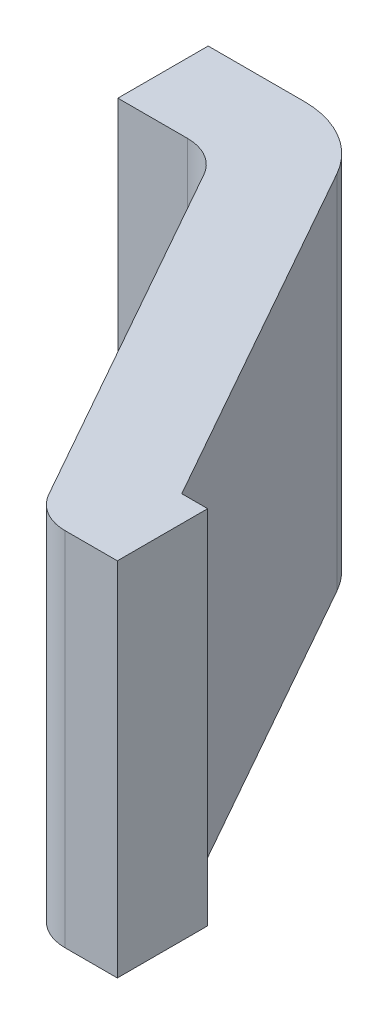
ISO-10303-21;
HEADER;
FILE_DESCRIPTION(('STEP AP214'),'2;1');
FILE_NAME('part.step','',(''),(''),'','','');
FILE_SCHEMA(('AUTOMOTIVE_DESIGN { 1 0 10303 214 1 1 1 1 }'));
ENDSEC;
DATA;
#1=APPLICATION_CONTEXT('core data for automotive mechanical design processes');
#2=APPLICATION_PROTOCOL_DEFINITION('international standard','automotive_design',2000,#1);
#3=PRODUCT_CONTEXT('',#1,'mechanical');
#4=PRODUCT('Part','Part','',(#3));
#5=PRODUCT_RELATED_PRODUCT_CATEGORY('part','',(#4));
#6=PRODUCT_DEFINITION_FORMATION('','',#4);
#7=PRODUCT_DEFINITION_CONTEXT('part definition',#1,'design');
#8=PRODUCT_DEFINITION('design','',#6,#7);
#9=PRODUCT_DEFINITION_SHAPE('','',#8);
#10=(LENGTH_UNIT() NAMED_UNIT(*) SI_UNIT(.MILLI.,.METRE.));
#11=(NAMED_UNIT(*) PLANE_ANGLE_UNIT() SI_UNIT($,.RADIAN.));
#12=(NAMED_UNIT(*) SI_UNIT($,.STERADIAN.) SOLID_ANGLE_UNIT());
#13=UNCERTAINTY_MEASURE_WITH_UNIT(LENGTH_MEASURE(1.E-05),#10,'distance_accuracy_value','');
#14=(GEOMETRIC_REPRESENTATION_CONTEXT(3) GLOBAL_UNCERTAINTY_ASSIGNED_CONTEXT((#13)) GLOBAL_UNIT_ASSIGNED_CONTEXT((#10,
#11,#12)) REPRESENTATION_CONTEXT('',''));
#15=CARTESIAN_POINT('',(0.,0.,0.));
#16=DIRECTION('',(0.,0.,1.));
#17=DIRECTION('',(1.,0.,0.));
#18=AXIS2_PLACEMENT_3D('',#15,#16,#17);
#19=CARTESIAN_POINT('',(-1.2,-1.1925,0.));
#20=DIRECTION('',(0.,0.,1.));
#21=DIRECTION('',(1.,0.,0.));
#22=AXIS2_PLACEMENT_3D('',#19,#20,#21);
#23=PLANE('',#22);
#24=DIRECTION('',(1.,0.,0.));
#25=VECTOR('',#24,1.);
#26=CARTESIAN_POINT('',(-0.916001712348,-1.1925,0.));
#27=LINE('',#26,#25);
#28=CARTESIAN_POINT('',(-1.2,-1.1925,0.));
#29=VERTEX_POINT('',#28);
#30=CARTESIAN_POINT('',(-1.070912757486,-1.1925,0.));
#31=VERTEX_POINT('',#30);
#32=EDGE_CURVE('E74',#29,#31,#27,.T.);
#33=ORIENTED_EDGE('',*,*,#32,.F.);
#34=DIRECTION('',(0.,1.,0.));
#35=VECTOR('',#34,1.);
#36=CARTESIAN_POINT('',(-1.2,-1.1925,0.));
#37=LINE('',#36,#35);
#38=CARTESIAN_POINT('',(-1.2,-0.7075,0.));
#39=VERTEX_POINT('',#38);
#40=EDGE_CURVE('E83',#29,#39,#37,.T.);
#41=ORIENTED_EDGE('',*,*,#40,.T.);
#42=DIRECTION('',(-1.,0.,0.));
#43=VECTOR('',#42,1.);
#44=CARTESIAN_POINT('',(-0.916001712348,-0.7075,0.));
#45=LINE('',#44,#43);
#46=CARTESIAN_POINT('',(-1.070912757486,-0.7075,0.));
#47=VERTEX_POINT('',#46);
#48=EDGE_CURVE('E154',#47,#39,#45,.T.);
#49=ORIENTED_EDGE('',*,*,#48,.F.);
#50=DIRECTION('',(0.,1.,0.));
#51=VECTOR('',#50,1.);
#52=CARTESIAN_POINT('',(-1.070912757486,-1.1925,0.));
#53=LINE('',#52,#51);
#54=EDGE_CURVE('E213',#31,#47,#53,.T.);
#55=ORIENTED_EDGE('',*,*,#54,.F.);
#56=EDGE_LOOP('',(#33,#41,#49,#55));
#57=FACE_BOUND('',#56,.T.);
#58=ADVANCED_FACE('F17',(#57),#23,.F.);
#59=CARTESIAN_POINT('',(-1.2,-1.1925,0.));
#60=DIRECTION('',(1.,0.,0.));
#61=DIRECTION('',(0.,0.,-1.));
#62=AXIS2_PLACEMENT_3D('',#59,#60,#61);
#63=PLANE('',#62);
#64=DIRECTION('',(0.,0.,1.));
#65=VECTOR('',#64,1.);
#66=CARTESIAN_POINT('',(-1.2,-0.7075,0.303649841369));
#67=LINE('',#66,#65);
#68=CARTESIAN_POINT('',(-1.2,-0.7075,0.12125));
#69=VERTEX_POINT('',#68);
#70=EDGE_CURVE('E151',#39,#69,#67,.T.);
#71=ORIENTED_EDGE('',*,*,#70,.F.);
#72=ORIENTED_EDGE('',*,*,#40,.F.);
#73=DIRECTION('',(0.,0.,1.));
#74=VECTOR('',#73,1.);
#75=CARTESIAN_POINT('',(-1.2,-1.1925,0.303649841369));
#76=LINE('',#75,#74);
#77=CARTESIAN_POINT('',(-1.2,-1.1925,0.12125));
#78=VERTEX_POINT('',#77);
#79=EDGE_CURVE('E146',#78,#29,#76,.F.);
#80=ORIENTED_EDGE('',*,*,#79,.F.);
#81=DIRECTION('',(0.,1.,0.));
#82=VECTOR('',#81,1.);
#83=CARTESIAN_POINT('',(-1.2,-1.1925,0.12125));
#84=LINE('',#83,#82);
#85=EDGE_CURVE('E147',#69,#78,#84,.F.);
#86=ORIENTED_EDGE('',*,*,#85,.F.);
#87=EDGE_LOOP('',(#71,#72,#80,#86));
#88=FACE_BOUND('',#87,.T.);
#89=ADVANCED_FACE('F238',(#88),#63,.F.);
#90=CARTESIAN_POINT('',(-1.2,-1.1925,0.12125));
#91=DIRECTION('',(0.,0.,1.));
#92=DIRECTION('',(1.,0.,0.));
#93=AXIS2_PLACEMENT_3D('',#90,#91,#92);
#94=PLANE('',#93);
#95=DIRECTION('',(1.,0.,0.));
#96=VECTOR('',#95,1.);
#97=CARTESIAN_POINT('',(-0.916001712348,-1.1925,0.12125));
#98=LINE('',#97,#96);
#99=CARTESIAN_POINT('',(-1.106369136228,-1.1925,0.12125));
#100=VERTEX_POINT('',#99);
#101=EDGE_CURVE('E161',#100,#78,#98,.F.);
#102=ORIENTED_EDGE('',*,*,#101,.F.);
#103=DIRECTION('',(0.,1.,0.));
#104=VECTOR('',#103,1.);
#105=CARTESIAN_POINT('',(-1.106369136228,-1.1925,0.12125));
#106=LINE('',#105,#104);
#107=CARTESIAN_POINT('',(-1.106369136228,-0.7075,0.12125));
#108=VERTEX_POINT('',#107);
#109=EDGE_CURVE('E142',#100,#108,#106,.T.);
#110=ORIENTED_EDGE('',*,*,#109,.T.);
#111=DIRECTION('',(-1.,0.,0.));
#112=VECTOR('',#111,1.);
#113=CARTESIAN_POINT('',(-0.916001712348,-0.7075,0.12125));
#114=LINE('',#113,#112);
#115=EDGE_CURVE('E153',#69,#108,#114,.F.);
#116=ORIENTED_EDGE('',*,*,#115,.F.);
#117=ORIENTED_EDGE('',*,*,#85,.T.);
#118=EDGE_LOOP('',(#102,#110,#116,#117));
#119=FACE_BOUND('',#118,.T.);
#120=ADVANCED_FACE('F244',(#119),#94,.T.);
#121=CARTESIAN_POINT('',(-0.6625,-1.1925,0.538194175305));
#122=DIRECTION('',(1.,0.,0.));
#123=DIRECTION('',(0.,0.,-1.));
#124=AXIS2_PLACEMENT_3D('',#121,#122,#123);
#125=PLANE('',#124);
#126=DIRECTION('',(0.,0.,1.));
#127=VECTOR('',#126,1.);
#128=CARTESIAN_POINT('',(-0.6625,-0.7075,0.303649841369));
#129=LINE('',#128,#127);
#130=CARTESIAN_POINT('',(-0.6625,-0.7075,0.659444175305));
#131=VERTEX_POINT('',#130);
#132=CARTESIAN_POINT('',(-0.6625,-0.7075,0.538194175305));
#133=VERTEX_POINT('',#132);
#134=EDGE_CURVE('E122',#131,#133,#129,.F.);
#135=ORIENTED_EDGE('',*,*,#134,.F.);
#136=DIRECTION('',(0.,1.,0.));
#137=VECTOR('',#136,1.);
#138=CARTESIAN_POINT('',(-0.6625,-1.1925,0.659444175305));
#139=LINE('',#138,#137);
#140=CARTESIAN_POINT('',(-0.6625,-1.1925,0.659444175305));
#141=VERTEX_POINT('',#140);
#142=EDGE_CURVE('E109',#141,#131,#139,.T.);
#143=ORIENTED_EDGE('',*,*,#142,.F.);
#144=DIRECTION('',(0.,0.,1.));
#145=VECTOR('',#144,1.);
#146=CARTESIAN_POINT('',(-0.6625,-1.1925,0.303649841369));
#147=LINE('',#146,#145);
#148=CARTESIAN_POINT('',(-0.6625,-1.1925,0.538194175305));
#149=VERTEX_POINT('',#148);
#150=EDGE_CURVE('E164',#149,#141,#147,.T.);
#151=ORIENTED_EDGE('',*,*,#150,.F.);
#152=DIRECTION('',(0.,1.,0.));
#153=VECTOR('',#152,1.);
#154=CARTESIAN_POINT('',(-0.6625,-1.1925,0.538194175305));
#155=LINE('',#154,#153);
#156=EDGE_CURVE('E128',#149,#133,#155,.T.);
#157=ORIENTED_EDGE('',*,*,#156,.T.);
#158=EDGE_LOOP('',(#135,#143,#151,#157));
#159=FACE_BOUND('',#158,.T.);
#160=ADVANCED_FACE('F127',(#159),#125,.T.);
#161=CARTESIAN_POINT('',(-0.768178533876,-1.1925,0.538194175305));
#162=DIRECTION('',(0.,0.,1.));
#163=DIRECTION('',(1.,0.,0.));
#164=AXIS2_PLACEMENT_3D('',#161,#162,#163);
#165=PLANE('',#164);
#166=DIRECTION('',(1.,0.,0.));
#167=VECTOR('',#166,1.);
#168=CARTESIAN_POINT('',(-0.916001712348,-1.1925,0.538194175305));
#169=LINE('',#168,#167);
#170=CARTESIAN_POINT('',(-0.697265776390867,-1.1925,0.538194175304925));
#171=VERTEX_POINT('',#170);
#172=EDGE_CURVE('E166',#171,#149,#169,.T.);
#173=ORIENTED_EDGE('',*,*,#172,.F.);
#174=DIRECTION('',(0.,1.,0.));
#175=VECTOR('',#174,1.);
#176=CARTESIAN_POINT('',(-0.697265776390601,-1.1925,0.538194175304775));
#177=LINE('',#176,#175);
#178=CARTESIAN_POINT('',(-0.697265776390867,-0.7075,0.538194175304925));
#179=VERTEX_POINT('',#178);
#180=EDGE_CURVE('E215',#179,#171,#177,.F.);
#181=ORIENTED_EDGE('',*,*,#180,.F.);
#182=DIRECTION('',(-1.,0.,0.));
#183=VECTOR('',#182,1.);
#184=CARTESIAN_POINT('',(-0.916001712348,-0.7075,0.538194175305));
#185=LINE('',#184,#183);
#186=EDGE_CURVE('E130',#133,#179,#185,.T.);
#187=ORIENTED_EDGE('',*,*,#186,.F.);
#188=ORIENTED_EDGE('',*,*,#156,.F.);
#189=EDGE_LOOP('',(#173,#181,#187,#188));
#190=FACE_BOUND('',#189,.T.);
#191=ADVANCED_FACE('F231',(#190),#165,.F.);
#192=CARTESIAN_POINT('',(-1.,-1.1925,0.));
#193=DIRECTION('',(0.871575537124229,0.,-0.490261239633129));
#194=DIRECTION('',(-0.490261239633129,0.,-0.871575537124229));
#195=AXIS2_PLACEMENT_3D('',#192,#193,#194);
#196=PLANE('',#195);
#197=DIRECTION('',(-0.490261239632034,0.,-0.871575537124845));
#198=VECTOR('',#197,1.);
#199=CARTESIAN_POINT('',(-0.697265776391,-0.7075,0.538194175305));
#200=LINE('',#199,#198);
#201=CARTESIAN_POINT('',(-0.965234223609306,-0.7075,0.061805824694583));
#202=VERTEX_POINT('',#201);
#203=EDGE_CURVE('E132',#179,#202,#200,.T.);
#204=ORIENTED_EDGE('',*,*,#203,.F.);
#205=ORIENTED_EDGE('',*,*,#180,.T.);
#206=DIRECTION('',(0.490261239632034,0.,0.871575537124845));
#207=VECTOR('',#206,1.);
#208=CARTESIAN_POINT('',(-0.965234223609,-1.1925,0.06180582469455));
#209=LINE('',#208,#207);
#210=CARTESIAN_POINT('',(-0.965234223609306,-1.1925,0.061805824694583));
#211=VERTEX_POINT('',#210);
#212=EDGE_CURVE('E171',#211,#171,#209,.T.);
#213=ORIENTED_EDGE('',*,*,#212,.F.);
#214=DIRECTION('',(0.,1.,0.));
#215=VECTOR('',#214,1.);
#216=CARTESIAN_POINT('',(-0.965234223609494,-1.1925,0.0618058246948276));
#217=LINE('',#216,#215);
#218=EDGE_CURVE('E118',#202,#211,#217,.F.);
#219=ORIENTED_EDGE('',*,*,#218,.F.);
#220=EDGE_LOOP('',(#204,#205,#213,#219));
#221=FACE_BOUND('',#220,.T.);
#222=ADVANCED_FACE('F225',(#221),#196,.T.);
#223=CARTESIAN_POINT('',(-1.070912757486,-1.1925,0.12125));
#224=DIRECTION('',(0.,1.,0.));
#225=DIRECTION('',(0.,0.,1.));
#226=AXIS2_PLACEMENT_3D('',#223,#224,#225);
#227=CYLINDRICAL_SURFACE('',#226,0.12125);
#228=ORIENTED_EDGE('',*,*,#218,.T.);
#229=CARTESIAN_POINT('',(-1.070912757486,-1.1925,0.12125));
#230=DIRECTION('',(0.,1.,0.));
#231=DIRECTION('',(0.,0.,1.));
#232=AXIS2_PLACEMENT_3D('',#229,#230,#231);
#233=CIRCLE('',#232,0.12125);
#234=EDGE_CURVE('E20',#31,#211,#233,.F.);
#235=ORIENTED_EDGE('',*,*,#234,.F.);
#236=ORIENTED_EDGE('',*,*,#54,.T.);
#237=CARTESIAN_POINT('',(-1.070912757486,-0.7075,0.12125));
#238=DIRECTION('',(0.,1.,0.));
#239=DIRECTION('',(0.,0.,1.));
#240=AXIS2_PLACEMENT_3D('',#237,#238,#239);
#241=CIRCLE('',#240,0.12125);
#242=EDGE_CURVE('E180',#202,#47,#241,.T.);
#243=ORIENTED_EDGE('',*,*,#242,.F.);
#244=EDGE_LOOP('',(#228,#235,#236,#243));
#245=FACE_BOUND('',#244,.T.);
#246=ADVANCED_FACE('F235',(#245),#227,.T.);
#247=CARTESIAN_POINT('',(-0.768178533876,-1.1925,0.659444175305));
#248=DIRECTION('',(0.,0.,1.));
#249=DIRECTION('',(1.,0.,0.));
#250=AXIS2_PLACEMENT_3D('',#247,#248,#249);
#251=PLANE('',#250);
#252=DIRECTION('',(-1.,0.,0.));
#253=VECTOR('',#252,1.);
#254=CARTESIAN_POINT('',(-0.916001712348,-0.7075,0.659444175305));
#255=LINE('',#254,#253);
#256=CARTESIAN_POINT('',(-0.732722155134,-0.7075,0.659444175305));
#257=VERTEX_POINT('',#256);
#258=EDGE_CURVE('E113',#257,#131,#255,.F.);
#259=ORIENTED_EDGE('',*,*,#258,.F.);
#260=DIRECTION('',(0.,1.,0.));
#261=VECTOR('',#260,1.);
#262=CARTESIAN_POINT('',(-0.732722155134,-1.1925,0.659444175305));
#263=LINE('',#262,#261);
#264=CARTESIAN_POINT('',(-0.732722155134,-1.1925,0.659444175305));
#265=VERTEX_POINT('',#264);
#266=EDGE_CURVE('E176',#265,#257,#263,.T.);
#267=ORIENTED_EDGE('',*,*,#266,.F.);
#268=DIRECTION('',(1.,0.,0.));
#269=VECTOR('',#268,1.);
#270=CARTESIAN_POINT('',(-0.916001712348,-1.1925,0.659444175305));
#271=LINE('',#270,#269);
#272=EDGE_CURVE('E114',#141,#265,#271,.F.);
#273=ORIENTED_EDGE('',*,*,#272,.F.);
#274=ORIENTED_EDGE('',*,*,#142,.T.);
#275=EDGE_LOOP('',(#259,#267,#273,#274));
#276=FACE_BOUND('',#275,.T.);
#277=ADVANCED_FACE('F111',(#276),#251,.T.);
#278=CARTESIAN_POINT('',(-0.916001712348,-1.1925,0.303649841369));
#279=DIRECTION('',(0.,-1.,0.));
#280=DIRECTION('',(1.,0.,0.));
#281=AXIS2_PLACEMENT_3D('',#278,#279,#280);
#282=PLANE('',#281);
#283=ORIENTED_EDGE('',*,*,#101,.T.);
#284=ORIENTED_EDGE('',*,*,#79,.T.);
#285=ORIENTED_EDGE('',*,*,#32,.T.);
#286=ORIENTED_EDGE('',*,*,#234,.T.);
#287=ORIENTED_EDGE('',*,*,#212,.T.);
#288=ORIENTED_EDGE('',*,*,#172,.T.);
#289=ORIENTED_EDGE('',*,*,#150,.T.);
#290=ORIENTED_EDGE('',*,*,#272,.T.);
#291=CARTESIAN_POINT('',(-0.732722155134,-1.1925,0.598819175305));
#292=DIRECTION('',(0.,1.,0.));
#293=DIRECTION('',(0.,0.,1.));
#294=AXIS2_PLACEMENT_3D('',#291,#292,#293);
#295=CIRCLE('',#294,0.060625);
#296=CARTESIAN_POINT('',(-0.785561422071273,-1.1925,0.628541262957427));
#297=VERTEX_POINT('',#296);
#298=EDGE_CURVE('E177',#297,#265,#295,.T.);
#299=ORIENTED_EDGE('',*,*,#298,.F.);
#300=DIRECTION('',(-0.490261239633129,0.,-0.871575537124229));
#301=VECTOR('',#300,1.);
#302=CARTESIAN_POINT('',(-1.105678533876,-1.1925,0.05944417530545));
#303=LINE('',#302,#301);
#304=CARTESIAN_POINT('',(-1.05352986928997,-1.1925,0.152152912347146));
#305=VERTEX_POINT('',#304);
#306=EDGE_CURVE('E175',#297,#305,#303,.T.);
#307=ORIENTED_EDGE('',*,*,#306,.T.);
#308=CARTESIAN_POINT('',(-1.106369136228,-1.1925,0.181875));
#309=DIRECTION('',(0.,1.,0.));
#310=DIRECTION('',(0.,0.,1.));
#311=AXIS2_PLACEMENT_3D('',#308,#309,#310);
#312=CIRCLE('',#311,0.060625);
#313=EDGE_CURVE('E145',#305,#100,#312,.T.);
#314=ORIENTED_EDGE('',*,*,#313,.T.);
#315=EDGE_LOOP('',(#283,#284,#285,#286,#287,#288,#289,#290,#299,#307,#314));
#316=FACE_BOUND('',#315,.T.);
#317=ADVANCED_FACE('F229',(#316),#282,.T.);
#318=CARTESIAN_POINT('',(-1.106369136228,-1.1925,0.181875));
#319=DIRECTION('',(0.,1.,0.));
#320=DIRECTION('',(0.,0.,1.));
#321=AXIS2_PLACEMENT_3D('',#318,#319,#320);
#322=CYLINDRICAL_SURFACE('',#321,0.060625);
#323=DIRECTION('',(0.,1.,0.));
#324=VECTOR('',#323,1.);
#325=CARTESIAN_POINT('',(-1.05352986929004,-1.1925,0.152152912347021));
#326=LINE('',#325,#324);
#327=CARTESIAN_POINT('',(-1.05352986928997,-0.7075,0.152152912347146));
#328=VERTEX_POINT('',#327);
#329=EDGE_CURVE('E194',#305,#328,#326,.T.);
#330=ORIENTED_EDGE('',*,*,#329,.T.);
#331=CARTESIAN_POINT('',(-1.106369136228,-0.7075,0.181875));
#332=DIRECTION('',(0.,1.,0.));
#333=DIRECTION('',(0.,0.,1.));
#334=AXIS2_PLACEMENT_3D('',#331,#332,#333);
#335=CIRCLE('',#334,0.060625);
#336=EDGE_CURVE('E125',#108,#328,#335,.F.);
#337=ORIENTED_EDGE('',*,*,#336,.F.);
#338=ORIENTED_EDGE('',*,*,#109,.F.);
#339=ORIENTED_EDGE('',*,*,#313,.F.);
#340=EDGE_LOOP('',(#330,#337,#338,#339));
#341=FACE_BOUND('',#340,.T.);
#342=ADVANCED_FACE('F246',(#341),#322,.F.);
#343=CARTESIAN_POINT('',(-0.916001712348,-0.7075,0.303649841369));
#344=DIRECTION('',(0.,1.,0.));
#345=DIRECTION('',(-1.,0.,0.));
#346=AXIS2_PLACEMENT_3D('',#343,#344,#345);
#347=PLANE('',#346);
#348=ORIENTED_EDGE('',*,*,#203,.T.);
#349=ORIENTED_EDGE('',*,*,#242,.T.);
#350=ORIENTED_EDGE('',*,*,#48,.T.);
#351=ORIENTED_EDGE('',*,*,#70,.T.);
#352=ORIENTED_EDGE('',*,*,#115,.T.);
#353=ORIENTED_EDGE('',*,*,#336,.T.);
#354=DIRECTION('',(-0.490261239633129,0.,-0.871575537124229));
#355=VECTOR('',#354,1.);
#356=CARTESIAN_POINT('',(-1.105678533876,-0.7075,0.05944417530545));
#357=LINE('',#356,#355);
#358=CARTESIAN_POINT('',(-0.785561422071273,-0.7075,0.628541262957427));
#359=VERTEX_POINT('',#358);
#360=EDGE_CURVE('E26',#328,#359,#357,.F.);
#361=ORIENTED_EDGE('',*,*,#360,.T.);
#362=CARTESIAN_POINT('',(-0.732722155134,-0.7075,0.598819175305));
#363=DIRECTION('',(0.,1.,0.));
#364=DIRECTION('',(0.,0.,1.));
#365=AXIS2_PLACEMENT_3D('',#362,#363,#364);
#366=CIRCLE('',#365,0.060625);
#367=EDGE_CURVE('E34',#257,#359,#366,.F.);
#368=ORIENTED_EDGE('',*,*,#367,.F.);
#369=ORIENTED_EDGE('',*,*,#258,.T.);
#370=ORIENTED_EDGE('',*,*,#134,.T.);
#371=ORIENTED_EDGE('',*,*,#186,.T.);
#372=EDGE_LOOP('',(#348,#349,#350,#351,#352,#353,#361,#368,#369,#370,#371));
#373=FACE_BOUND('',#372,.T.);
#374=ADVANCED_FACE('F121',(#373),#347,.T.);
#375=CARTESIAN_POINT('',(-0.732722155134,-1.1925,0.598819175305));
#376=DIRECTION('',(0.,1.,0.));
#377=DIRECTION('',(0.,0.,1.));
#378=AXIS2_PLACEMENT_3D('',#375,#376,#377);
#379=CYLINDRICAL_SURFACE('',#378,0.060625);
#380=ORIENTED_EDGE('',*,*,#367,.T.);
#381=DIRECTION('',(0.,1.,0.));
#382=VECTOR('',#381,1.);
#383=CARTESIAN_POINT('',(-0.785561422071203,-1.1925,0.628541262957552));
#384=LINE('',#383,#382);
#385=EDGE_CURVE('E11',#359,#297,#384,.F.);
#386=ORIENTED_EDGE('',*,*,#385,.T.);
#387=ORIENTED_EDGE('',*,*,#298,.T.);
#388=ORIENTED_EDGE('',*,*,#266,.T.);
#389=EDGE_LOOP('',(#380,#386,#387,#388));
#390=FACE_BOUND('',#389,.T.);
#391=ADVANCED_FACE('F251',(#390),#379,.T.);
#392=CARTESIAN_POINT('',(-1.105678533876,-1.1925,0.05944417530545));
#393=DIRECTION('',(0.871575537124229,0.,-0.490261239633129));
#394=DIRECTION('',(-0.490261239633129,0.,-0.871575537124229));
#395=AXIS2_PLACEMENT_3D('',#392,#393,#394);
#396=PLANE('',#395);
#397=ORIENTED_EDGE('',*,*,#360,.F.);
#398=ORIENTED_EDGE('',*,*,#329,.F.);
#399=ORIENTED_EDGE('',*,*,#306,.F.);
#400=ORIENTED_EDGE('',*,*,#385,.F.);
#401=EDGE_LOOP('',(#397,#398,#399,#400));
#402=FACE_BOUND('',#401,.T.);
#403=ADVANCED_FACE('F249',(#402),#396,.F.);
#404=CLOSED_SHELL('',(#58,#89,#120,#160,#191,#222,#246,#277,#317,#342,#374,#391,#403));
#405=MANIFOLD_SOLID_BREP('B1',#404);
#406=ADVANCED_BREP_SHAPE_REPRESENTATION('',(#18,#405),#14);
#407=SHAPE_DEFINITION_REPRESENTATION(#9,#406);
ENDSEC;
END-ISO-10303-21;
